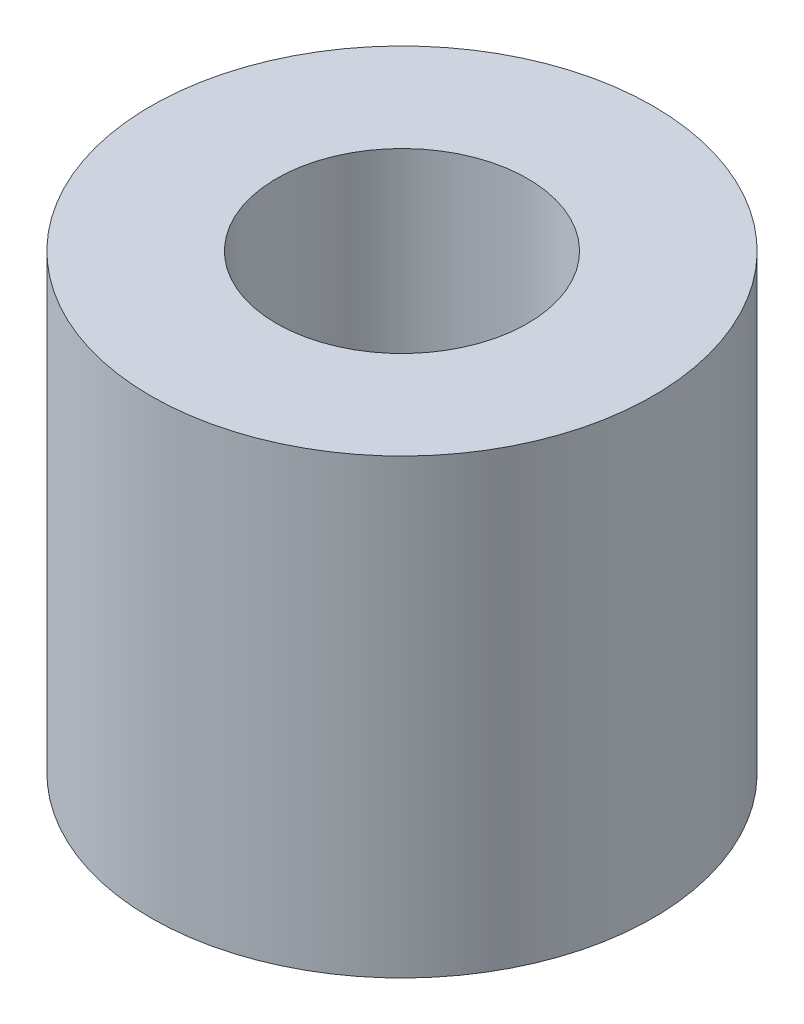
ISO-10303-21;
HEADER;
FILE_DESCRIPTION(('STEP AP214'),'2;1');
FILE_NAME('part.step','',(''),(''),'','','');
FILE_SCHEMA(('AUTOMOTIVE_DESIGN { 1 0 10303 214 1 1 1 1 }'));
ENDSEC;
DATA;
#1=APPLICATION_CONTEXT('core data for automotive mechanical design processes');
#2=APPLICATION_PROTOCOL_DEFINITION('international standard','automotive_design',2000,#1);
#3=PRODUCT_CONTEXT('',#1,'mechanical');
#4=PRODUCT('Part','Part','',(#3));
#5=PRODUCT_RELATED_PRODUCT_CATEGORY('part','',(#4));
#6=PRODUCT_DEFINITION_FORMATION('','',#4);
#7=PRODUCT_DEFINITION_CONTEXT('part definition',#1,'design');
#8=PRODUCT_DEFINITION('design','',#6,#7);
#9=PRODUCT_DEFINITION_SHAPE('','',#8);
#10=(LENGTH_UNIT() NAMED_UNIT(*) SI_UNIT(.MILLI.,.METRE.));
#11=(NAMED_UNIT(*) PLANE_ANGLE_UNIT() SI_UNIT($,.RADIAN.));
#12=(NAMED_UNIT(*) SI_UNIT($,.STERADIAN.) SOLID_ANGLE_UNIT());
#13=UNCERTAINTY_MEASURE_WITH_UNIT(LENGTH_MEASURE(1.E-05),#10,'distance_accuracy_value','');
#14=(GEOMETRIC_REPRESENTATION_CONTEXT(3) GLOBAL_UNCERTAINTY_ASSIGNED_CONTEXT((#13)) GLOBAL_UNIT_ASSIGNED_CONTEXT((#10,
#11,#12)) REPRESENTATION_CONTEXT('',''));
#15=CARTESIAN_POINT('',(0.,0.,0.));
#16=DIRECTION('',(0.,0.,1.));
#17=DIRECTION('',(1.,0.,0.));
#18=AXIS2_PLACEMENT_3D('',#15,#16,#17);
#19=CARTESIAN_POINT('',(0.,9.,0.));
#20=DIRECTION('',(0.,1.,0.));
#21=DIRECTION('',(0.,0.,1.));
#22=AXIS2_PLACEMENT_3D('',#19,#20,#21);
#23=PLANE('',#22);
#24=CARTESIAN_POINT('',(0.,9.,0.));
#25=DIRECTION('',(0.,1.,0.));
#26=DIRECTION('',(0.,0.,1.));
#27=AXIS2_PLACEMENT_3D('',#24,#25,#26);
#28=CIRCLE('',#27,5.);
#29=CARTESIAN_POINT('',(0.,9.,5.));
#30=VERTEX_POINT('',#29);
#31=EDGE_CURVE('E10',#30,#30,#28,.T.);
#32=ORIENTED_EDGE('',*,*,#31,.T.);
#33=EDGE_LOOP('',(#32));
#34=FACE_BOUND('',#33,.T.);
#35=CARTESIAN_POINT('',(0.,9.,0.));
#36=DIRECTION('',(0.,1.,0.));
#37=DIRECTION('',(0.,0.,1.));
#38=AXIS2_PLACEMENT_3D('',#35,#36,#37);
#39=CIRCLE('',#38,2.5);
#40=CARTESIAN_POINT('',(0.,9.,2.5));
#41=VERTEX_POINT('',#40);
#42=EDGE_CURVE('E50',#41,#41,#39,.T.);
#43=ORIENTED_EDGE('',*,*,#42,.F.);
#44=EDGE_LOOP('',(#43));
#45=FACE_BOUND('',#44,.T.);
#46=ADVANCED_FACE('F39',(#34,#45),#23,.T.);
#47=CARTESIAN_POINT('',(0.,0.,0.));
#48=DIRECTION('',(0.,1.,0.));
#49=DIRECTION('',(0.,0.,1.));
#50=AXIS2_PLACEMENT_3D('',#47,#48,#49);
#51=PLANE('',#50);
#52=CARTESIAN_POINT('',(0.,0.,0.));
#53=DIRECTION('',(0.,1.,0.));
#54=DIRECTION('',(0.,0.,1.));
#55=AXIS2_PLACEMENT_3D('',#52,#53,#54);
#56=CIRCLE('',#55,5.);
#57=CARTESIAN_POINT('',(0.,0.,5.));
#58=VERTEX_POINT('',#57);
#59=EDGE_CURVE('E43',#58,#58,#56,.T.);
#60=ORIENTED_EDGE('',*,*,#59,.F.);
#61=EDGE_LOOP('',(#60));
#62=FACE_BOUND('',#61,.T.);
#63=CARTESIAN_POINT('',(0.,0.,0.));
#64=DIRECTION('',(0.,1.,0.));
#65=DIRECTION('',(0.,0.,1.));
#66=AXIS2_PLACEMENT_3D('',#63,#64,#65);
#67=CIRCLE('',#66,2.5);
#68=CARTESIAN_POINT('',(0.,0.,2.5));
#69=VERTEX_POINT('',#68);
#70=EDGE_CURVE('E52',#69,#69,#67,.T.);
#71=ORIENTED_EDGE('',*,*,#70,.T.);
#72=EDGE_LOOP('',(#71));
#73=FACE_BOUND('',#72,.T.);
#74=ADVANCED_FACE('F62',(#62,#73),#51,.F.);
#75=CARTESIAN_POINT('',(0.,9.,0.));
#76=DIRECTION('',(0.,-1.,0.));
#77=DIRECTION('',(0.,0.,-1.));
#78=AXIS2_PLACEMENT_3D('',#75,#76,#77);
#79=CYLINDRICAL_SURFACE('',#78,5.);
#80=ORIENTED_EDGE('',*,*,#31,.F.);
#81=EDGE_LOOP('',(#80));
#82=FACE_BOUND('',#81,.T.);
#83=ORIENTED_EDGE('',*,*,#59,.T.);
#84=EDGE_LOOP('',(#83));
#85=FACE_BOUND('',#84,.T.);
#86=ADVANCED_FACE('F41',(#82,#85),#79,.T.);
#87=CARTESIAN_POINT('',(0.,9.,0.));
#88=DIRECTION('',(0.,-1.,0.));
#89=DIRECTION('',(0.,0.,-1.));
#90=AXIS2_PLACEMENT_3D('',#87,#88,#89);
#91=CYLINDRICAL_SURFACE('',#90,2.5);
#92=ORIENTED_EDGE('',*,*,#42,.T.);
#93=EDGE_LOOP('',(#92));
#94=FACE_BOUND('',#93,.T.);
#95=ORIENTED_EDGE('',*,*,#70,.F.);
#96=EDGE_LOOP('',(#95));
#97=FACE_BOUND('',#96,.T.);
#98=ADVANCED_FACE('F58',(#94,#97),#91,.F.);
#99=CLOSED_SHELL('',(#46,#74,#86,#98));
#100=MANIFOLD_SOLID_BREP('B2',#99);
#101=ADVANCED_BREP_SHAPE_REPRESENTATION('',(#18,#100),#14);
#102=SHAPE_DEFINITION_REPRESENTATION(#9,#101);
ENDSEC;
END-ISO-10303-21;
